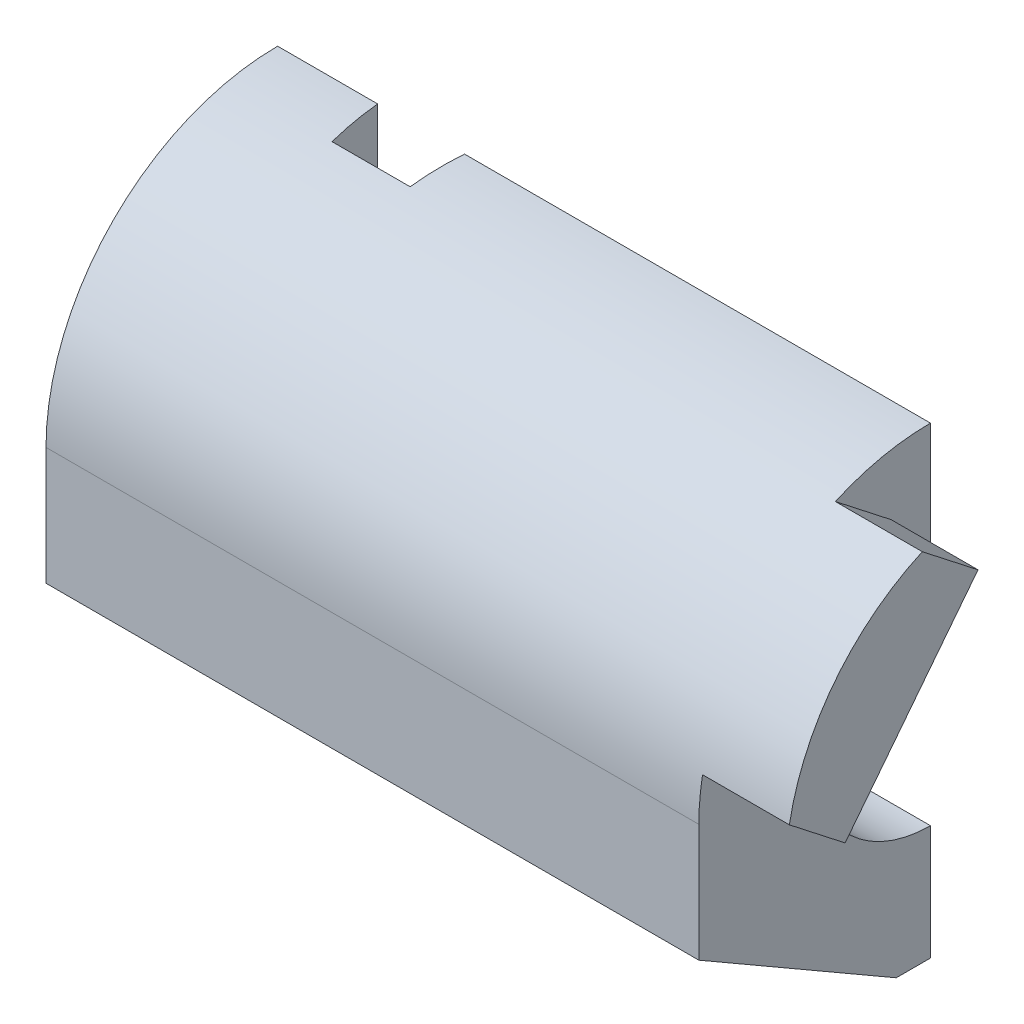
ISO-10303-21;
HEADER;
FILE_DESCRIPTION(('STEP AP214'),'2;1');
FILE_NAME('part.step','',(''),(''),'','','');
FILE_SCHEMA(('AUTOMOTIVE_DESIGN { 1 0 10303 214 1 1 1 1 }'));
ENDSEC;
DATA;
#1=APPLICATION_CONTEXT('core data for automotive mechanical design processes');
#2=APPLICATION_PROTOCOL_DEFINITION('international standard','automotive_design',2000,#1);
#3=PRODUCT_CONTEXT('',#1,'mechanical');
#4=PRODUCT('Part','Part','',(#3));
#5=PRODUCT_RELATED_PRODUCT_CATEGORY('part','',(#4));
#6=PRODUCT_DEFINITION_FORMATION('','',#4);
#7=PRODUCT_DEFINITION_CONTEXT('part definition',#1,'design');
#8=PRODUCT_DEFINITION('design','',#6,#7);
#9=PRODUCT_DEFINITION_SHAPE('','',#8);
#10=(LENGTH_UNIT() NAMED_UNIT(*) SI_UNIT(.MILLI.,.METRE.));
#11=(NAMED_UNIT(*) PLANE_ANGLE_UNIT() SI_UNIT($,.RADIAN.));
#12=(NAMED_UNIT(*) SI_UNIT($,.STERADIAN.) SOLID_ANGLE_UNIT());
#13=UNCERTAINTY_MEASURE_WITH_UNIT(LENGTH_MEASURE(1.E-05),#10,'distance_accuracy_value','');
#14=(GEOMETRIC_REPRESENTATION_CONTEXT(3) GLOBAL_UNCERTAINTY_ASSIGNED_CONTEXT((#13)) GLOBAL_UNIT_ASSIGNED_CONTEXT((#10,
#11,#12)) REPRESENTATION_CONTEXT('',''));
#15=CARTESIAN_POINT('',(0.,0.,0.));
#16=DIRECTION('',(0.,0.,1.));
#17=DIRECTION('',(1.,0.,0.));
#18=AXIS2_PLACEMENT_3D('',#15,#16,#17);
#19=CARTESIAN_POINT('',(124.,88.,0.));
#20=DIRECTION('',(0.,0.,1.));
#21=DIRECTION('',(0.,-1.,0.));
#22=AXIS2_PLACEMENT_3D('',#19,#20,#21);
#23=PLANE('',#22);
#24=DIRECTION('',(0.,-1.,0.));
#25=VECTOR('',#24,1.);
#26=CARTESIAN_POINT('',(-53.,88.,0.));
#27=LINE('',#26,#25);
#28=CARTESIAN_POINT('',(-53.,88.,0.));
#29=VERTEX_POINT('',#28);
#30=CARTESIAN_POINT('',(-53.,28.575,0.));
#31=VERTEX_POINT('',#30);
#32=EDGE_CURVE('E213',#29,#31,#27,.T.);
#33=ORIENTED_EDGE('',*,*,#32,.F.);
#34=DIRECTION('',(-1.,0.,0.));
#35=VECTOR('',#34,1.);
#36=CARTESIAN_POINT('',(124.,88.,0.));
#37=LINE('',#36,#35);
#38=CARTESIAN_POINT('',(124.,88.,0.));
#39=VERTEX_POINT('',#38);
#40=EDGE_CURVE('E303',#39,#29,#37,.T.);
#41=ORIENTED_EDGE('',*,*,#40,.F.);
#42=DIRECTION('',(0.,1.,0.));
#43=VECTOR('',#42,1.);
#44=CARTESIAN_POINT('',(124.,88.,0.));
#45=LINE('',#44,#43);
#46=CARTESIAN_POINT('',(124.,44.45,0.));
#47=VERTEX_POINT('',#46);
#48=EDGE_CURVE('E281',#47,#39,#45,.T.);
#49=ORIENTED_EDGE('',*,*,#48,.F.);
#50=DIRECTION('',(1.,0.,0.));
#51=VECTOR('',#50,1.);
#52=CARTESIAN_POINT('',(46.,44.45,0.));
#53=LINE('',#52,#51);
#54=CARTESIAN_POINT('',(46.,44.45,0.));
#55=VERTEX_POINT('',#54);
#56=EDGE_CURVE('E265',#47,#55,#53,.F.);
#57=ORIENTED_EDGE('',*,*,#56,.T.);
#58=DIRECTION('',(0.,1.,0.));
#59=VECTOR('',#58,1.);
#60=CARTESIAN_POINT('',(46.,88.,0.));
#61=LINE('',#60,#59);
#62=CARTESIAN_POINT('',(46.,28.575,0.));
#63=VERTEX_POINT('',#62);
#64=EDGE_CURVE('E315',#63,#55,#61,.T.);
#65=ORIENTED_EDGE('',*,*,#64,.F.);
#66=DIRECTION('',(-1.,0.,0.));
#67=VECTOR('',#66,1.);
#68=CARTESIAN_POINT('',(126.822305089622,28.575,0.));
#69=LINE('',#68,#67);
#70=EDGE_CURVE('E258',#63,#31,#69,.T.);
#71=ORIENTED_EDGE('',*,*,#70,.T.);
#72=EDGE_LOOP('',(#33,#41,#49,#57,#65,#71));
#73=FACE_BOUND('',#72,.T.);
#74=ADVANCED_FACE('F34',(#73),#23,.F.);
#75=DIRECTION('',(0.,-1.,0.));
#76=VECTOR('',#75,1.);
#77=CARTESIAN_POINT('',(-86.,88.,0.));
#78=LINE('',#77,#76);
#79=CARTESIAN_POINT('',(-86.,88.,0.));
#80=VERTEX_POINT('',#79);
#81=CARTESIAN_POINT('',(-86.,28.575,0.));
#82=VERTEX_POINT('',#81);
#83=EDGE_CURVE('E210',#80,#82,#78,.T.);
#84=ORIENTED_EDGE('',*,*,#83,.T.);
#85=CARTESIAN_POINT('',(-124.,28.575,0.));
#86=VERTEX_POINT('',#85);
#87=EDGE_CURVE('E257',#82,#86,#69,.T.);
#88=ORIENTED_EDGE('',*,*,#87,.T.);
#89=DIRECTION('',(0.,1.,0.));
#90=VECTOR('',#89,1.);
#91=CARTESIAN_POINT('',(-124.,88.,0.));
#92=LINE('',#91,#90);
#93=CARTESIAN_POINT('',(-124.,88.,0.));
#94=VERTEX_POINT('',#93);
#95=EDGE_CURVE('E294',#86,#94,#92,.T.);
#96=ORIENTED_EDGE('',*,*,#95,.T.);
#97=EDGE_CURVE('E302',#80,#94,#37,.T.);
#98=ORIENTED_EDGE('',*,*,#97,.F.);
#99=EDGE_LOOP('',(#84,#88,#96,#98));
#100=FACE_BOUND('',#99,.T.);
#101=ADVANCED_FACE('F330',(#100),#23,.F.);
#102=CARTESIAN_POINT('',(124.,0.,0.));
#103=DIRECTION('',(-1.,0.,0.));
#104=DIRECTION('',(0.,0.,1.));
#105=AXIS2_PLACEMENT_3D('',#102,#103,#104);
#106=CYLINDRICAL_SURFACE('',#105,88.);
#107=CARTESIAN_POINT('',(-53.,0.,0.));
#108=DIRECTION('',(-0.996194698091746,0.,-0.0871557427476584));
#109=DIRECTION('',(-0.0871557427476584,0.,0.996194698091746));
#110=AXIS2_PLACEMENT_3D('',#107,#108,#109);
#111=ELLIPSE('',#110,88.3361457038146,88.);
#112=CARTESIAN_POINT('',(-54.6622846069926,85.9243853629457,19.));
#113=VERTEX_POINT('',#112);
#114=EDGE_CURVE('E219',#113,#29,#111,.T.);
#115=ORIENTED_EDGE('',*,*,#114,.F.);
#116=DIRECTION('',(-1.,0.,0.));
#117=VECTOR('',#116,1.);
#118=CARTESIAN_POINT('',(124.,85.9243853629457,19.));
#119=LINE('',#118,#117);
#120=CARTESIAN_POINT('',(-84.3377153930074,85.9243853629457,19.));
#121=VERTEX_POINT('',#120);
#122=EDGE_CURVE('E215',#121,#113,#119,.F.);
#123=ORIENTED_EDGE('',*,*,#122,.F.);
#124=CARTESIAN_POINT('',(-86.,0.,0.));
#125=DIRECTION('',(0.996194698091746,0.,-0.087155742747658));
#126=DIRECTION('',(-0.087155742747658,0.,-0.996194698091746));
#127=AXIS2_PLACEMENT_3D('',#124,#125,#126);
#128=ELLIPSE('',#127,88.3361457038146,88.);
#129=EDGE_CURVE('E217',#80,#121,#128,.T.);
#130=ORIENTED_EDGE('',*,*,#129,.F.);
#131=ORIENTED_EDGE('',*,*,#97,.T.);
#132=CARTESIAN_POINT('',(-124.,0.,0.));
#133=DIRECTION('',(1.,0.,0.));
#134=DIRECTION('',(0.,0.,-1.));
#135=AXIS2_PLACEMENT_3D('',#132,#133,#134);
#136=CIRCLE('',#135,88.);
#137=CARTESIAN_POINT('',(-124.,0.,88.));
#138=VERTEX_POINT('',#137);
#139=EDGE_CURVE('E277',#94,#138,#136,.T.);
#140=ORIENTED_EDGE('',*,*,#139,.T.);
#141=DIRECTION('',(-1.,0.,0.));
#142=VECTOR('',#141,1.);
#143=CARTESIAN_POINT('',(124.,0.,88.));
#144=LINE('',#143,#142);
#145=CARTESIAN_POINT('',(124.,0.,88.));
#146=VERTEX_POINT('',#145);
#147=EDGE_CURVE('E287',#146,#138,#144,.T.);
#148=ORIENTED_EDGE('',*,*,#147,.F.);
#149=CARTESIAN_POINT('',(124.,0.,0.));
#150=DIRECTION('',(1.,0.,0.));
#151=DIRECTION('',(0.,0.,-1.));
#152=AXIS2_PLACEMENT_3D('',#149,#150,#151);
#153=CIRCLE('',#152,88.);
#154=CARTESIAN_POINT('',(124.,15.6302050309526,86.6007892036232));
#155=VERTEX_POINT('',#154);
#156=EDGE_CURVE('E199',#155,#146,#153,.T.);
#157=ORIENTED_EDGE('',*,*,#156,.F.);
#158=DIRECTION('',(-1.,0.,0.));
#159=VECTOR('',#158,1.);
#160=CARTESIAN_POINT('',(157.,15.6302050309526,86.6007892036232));
#161=LINE('',#160,#159);
#162=CARTESIAN_POINT('',(157.,15.6302050309526,86.6007892036232));
#163=VERTEX_POINT('',#162);
#164=EDGE_CURVE('E180',#163,#155,#161,.T.);
#165=ORIENTED_EDGE('',*,*,#164,.F.);
#166=CARTESIAN_POINT('',(157.,0.,0.));
#167=DIRECTION('',(1.,0.,0.));
#168=DIRECTION('',(0.,0.,-1.));
#169=AXIS2_PLACEMENT_3D('',#166,#167,#168);
#170=CIRCLE('',#169,88.);
#171=CARTESIAN_POINT('',(157.,80.2470868267041,36.1165482269196));
#172=VERTEX_POINT('',#171);
#173=EDGE_CURVE('E186',#172,#163,#170,.T.);
#174=ORIENTED_EDGE('',*,*,#173,.F.);
#175=DIRECTION('',(-1.,0.,0.));
#176=VECTOR('',#175,1.);
#177=CARTESIAN_POINT('',(157.,80.2470868267041,36.1165482269196));
#178=LINE('',#177,#176);
#179=CARTESIAN_POINT('',(124.,80.2470868267041,36.1165482269196));
#180=VERTEX_POINT('',#179);
#181=EDGE_CURVE('E391',#172,#180,#178,.T.);
#182=ORIENTED_EDGE('',*,*,#181,.T.);
#183=EDGE_CURVE('E285',#39,#180,#153,.T.);
#184=ORIENTED_EDGE('',*,*,#183,.F.);
#185=ORIENTED_EDGE('',*,*,#40,.T.);
#186=EDGE_LOOP('',(#115,#123,#130,#131,#140,#148,#157,#165,#174,#182,#184,#185));
#187=FACE_BOUND('',#186,.T.);
#188=ADVANCED_FACE('F197',(#187),#106,.T.);
#189=CARTESIAN_POINT('',(126.822305089622,0.,0.));
#190=DIRECTION('',(-1.,0.,0.));
#191=DIRECTION('',(0.,0.,1.));
#192=AXIS2_PLACEMENT_3D('',#189,#190,#191);
#193=CYLINDRICAL_SURFACE('',#192,28.575);
#194=CARTESIAN_POINT('',(-53.,0.,0.));
#195=DIRECTION('',(-0.996194698091746,0.,-0.0871557427476584));
#196=DIRECTION('',(-0.0871557427476584,0.,0.996194698091746));
#197=AXIS2_PLACEMENT_3D('',#194,#195,#196);
#198=ELLIPSE('',#197,28.6841518578012,28.575);
#199=CARTESIAN_POINT('',(-54.6622846069925,21.343163425322,19.));
#200=VERTEX_POINT('',#199);
#201=EDGE_CURVE('E11',#31,#200,#198,.F.);
#202=ORIENTED_EDGE('',*,*,#201,.F.);
#203=ORIENTED_EDGE('',*,*,#70,.F.);
#204=CARTESIAN_POINT('',(46.,0.,0.));
#205=DIRECTION('',(1.,0.,0.));
#206=DIRECTION('',(0.,0.,-1.));
#207=AXIS2_PLACEMENT_3D('',#204,#205,#206);
#208=CIRCLE('',#207,28.575);
#209=CARTESIAN_POINT('',(46.,-28.575,0.));
#210=VERTEX_POINT('',#209);
#211=EDGE_CURVE('E251',#210,#63,#208,.F.);
#212=ORIENTED_EDGE('',*,*,#211,.F.);
#213=DIRECTION('',(-1.,0.,0.));
#214=VECTOR('',#213,1.);
#215=CARTESIAN_POINT('',(126.822305089622,-28.575,0.));
#216=LINE('',#215,#214);
#217=CARTESIAN_POINT('',(-124.,-28.575,0.));
#218=VERTEX_POINT('',#217);
#219=EDGE_CURVE('E254',#218,#210,#216,.F.);
#220=ORIENTED_EDGE('',*,*,#219,.F.);
#221=CARTESIAN_POINT('',(-124.,0.,0.));
#222=DIRECTION('',(-1.,0.,0.));
#223=DIRECTION('',(0.,0.,1.));
#224=AXIS2_PLACEMENT_3D('',#221,#222,#223);
#225=CIRCLE('',#224,28.575);
#226=EDGE_CURVE('E242',#218,#86,#225,.T.);
#227=ORIENTED_EDGE('',*,*,#226,.T.);
#228=ORIENTED_EDGE('',*,*,#87,.F.);
#229=CARTESIAN_POINT('',(-86.,0.,0.));
#230=DIRECTION('',(0.996194698091746,0.,-0.087155742747658));
#231=DIRECTION('',(-0.087155742747658,0.,-0.996194698091746));
#232=AXIS2_PLACEMENT_3D('',#229,#230,#231);
#233=ELLIPSE('',#232,28.6841518578012,28.575);
#234=CARTESIAN_POINT('',(-84.3377153930074,21.343163425322,19.));
#235=VERTEX_POINT('',#234);
#236=EDGE_CURVE('E42',#235,#82,#233,.F.);
#237=ORIENTED_EDGE('',*,*,#236,.F.);
#238=DIRECTION('',(-1.,0.,0.));
#239=VECTOR('',#238,1.);
#240=CARTESIAN_POINT('',(126.822305089622,21.343163425322,19.));
#241=LINE('',#240,#239);
#242=EDGE_CURVE('E319',#200,#235,#241,.T.);
#243=ORIENTED_EDGE('',*,*,#242,.F.);
#244=EDGE_LOOP('',(#202,#203,#212,#220,#227,#228,#237,#243));
#245=FACE_BOUND('',#244,.T.);
#246=ADVANCED_FACE('F333',(#245),#193,.F.);
#247=CARTESIAN_POINT('',(124.,-44.6987298107779,88.));
#248=DIRECTION('',(0.,0.,-1.));
#249=DIRECTION('',(0.,1.,0.));
#250=AXIS2_PLACEMENT_3D('',#247,#248,#249);
#251=PLANE('',#250);
#252=DIRECTION('',(0.,-1.,0.));
#253=VECTOR('',#252,1.);
#254=CARTESIAN_POINT('',(-124.,-44.6987298107779,88.));
#255=LINE('',#254,#253);
#256=CARTESIAN_POINT('',(-124.,-44.6987298107779,88.));
#257=VERTEX_POINT('',#256);
#258=EDGE_CURVE('E272',#138,#257,#255,.T.);
#259=ORIENTED_EDGE('',*,*,#258,.T.);
#260=DIRECTION('',(-1.,0.,0.));
#261=VECTOR('',#260,1.);
#262=CARTESIAN_POINT('',(124.,-44.6987298107779,88.));
#263=LINE('',#262,#261);
#264=CARTESIAN_POINT('',(124.,-44.6987298107779,88.));
#265=VERTEX_POINT('',#264);
#266=EDGE_CURVE('E312',#265,#257,#263,.T.);
#267=ORIENTED_EDGE('',*,*,#266,.F.);
#268=DIRECTION('',(0.,-1.,0.));
#269=VECTOR('',#268,1.);
#270=CARTESIAN_POINT('',(124.,-44.6987298107779,88.));
#271=LINE('',#270,#269);
#272=EDGE_CURVE('E273',#146,#265,#271,.T.);
#273=ORIENTED_EDGE('',*,*,#272,.F.);
#274=ORIENTED_EDGE('',*,*,#147,.T.);
#275=EDGE_LOOP('',(#259,#267,#273,#274));
#276=FACE_BOUND('',#275,.T.);
#277=ADVANCED_FACE('F36',(#276),#251,.F.);
#278=CARTESIAN_POINT('',(124.,-88.,13.));
#279=DIRECTION('',(0.,0.866025403784438,-0.500000000000001));
#280=DIRECTION('',(0.,0.500000000000001,0.866025403784438));
#281=AXIS2_PLACEMENT_3D('',#278,#279,#280);
#282=PLANE('',#281);
#283=DIRECTION('',(0.,-0.500000000000001,-0.866025403784438));
#284=VECTOR('',#283,1.);
#285=CARTESIAN_POINT('',(-124.,-88.,13.));
#286=LINE('',#285,#284);
#287=CARTESIAN_POINT('',(-124.,-88.,13.));
#288=VERTEX_POINT('',#287);
#289=EDGE_CURVE('E290',#257,#288,#286,.T.);
#290=ORIENTED_EDGE('',*,*,#289,.T.);
#291=DIRECTION('',(-1.,0.,0.));
#292=VECTOR('',#291,1.);
#293=CARTESIAN_POINT('',(124.,-88.,13.));
#294=LINE('',#293,#292);
#295=CARTESIAN_POINT('',(124.,-88.,13.));
#296=VERTEX_POINT('',#295);
#297=EDGE_CURVE('E309',#296,#288,#294,.T.);
#298=ORIENTED_EDGE('',*,*,#297,.F.);
#299=DIRECTION('',(0.,-0.500000000000001,-0.866025403784438));
#300=VECTOR('',#299,1.);
#301=CARTESIAN_POINT('',(124.,-88.,13.));
#302=LINE('',#301,#300);
#303=EDGE_CURVE('E276',#265,#296,#302,.T.);
#304=ORIENTED_EDGE('',*,*,#303,.F.);
#305=ORIENTED_EDGE('',*,*,#266,.T.);
#306=EDGE_LOOP('',(#290,#298,#304,#305));
#307=FACE_BOUND('',#306,.T.);
#308=ADVANCED_FACE('F370',(#307),#282,.F.);
#309=CARTESIAN_POINT('',(124.,-88.,0.));
#310=DIRECTION('',(0.,1.,0.));
#311=DIRECTION('',(0.,0.,1.));
#312=AXIS2_PLACEMENT_3D('',#309,#310,#311);
#313=PLANE('',#312);
#314=DIRECTION('',(0.,0.,-1.));
#315=VECTOR('',#314,1.);
#316=CARTESIAN_POINT('',(-124.,-88.,0.));
#317=LINE('',#316,#315);
#318=CARTESIAN_POINT('',(-124.,-88.,0.));
#319=VERTEX_POINT('',#318);
#320=EDGE_CURVE('E292',#288,#319,#317,.T.);
#321=ORIENTED_EDGE('',*,*,#320,.T.);
#322=DIRECTION('',(-1.,0.,0.));
#323=VECTOR('',#322,1.);
#324=CARTESIAN_POINT('',(124.,-88.,0.));
#325=LINE('',#324,#323);
#326=CARTESIAN_POINT('',(124.,-88.,0.));
#327=VERTEX_POINT('',#326);
#328=EDGE_CURVE('E306',#327,#319,#325,.T.);
#329=ORIENTED_EDGE('',*,*,#328,.F.);
#330=DIRECTION('',(0.,0.,-1.));
#331=VECTOR('',#330,1.);
#332=CARTESIAN_POINT('',(124.,-88.,0.));
#333=LINE('',#332,#331);
#334=EDGE_CURVE('E279',#296,#327,#333,.T.);
#335=ORIENTED_EDGE('',*,*,#334,.F.);
#336=ORIENTED_EDGE('',*,*,#297,.T.);
#337=EDGE_LOOP('',(#321,#329,#335,#336));
#338=FACE_BOUND('',#337,.T.);
#339=ADVANCED_FACE('F366',(#338),#313,.F.);
#340=CARTESIAN_POINT('',(-11.,-62.,0.));
#341=DIRECTION('',(0.,0.,-1.));
#342=DIRECTION('',(0.,1.,0.));
#343=AXIS2_PLACEMENT_3D('',#340,#341,#342);
#344=CIRCLE('',#343,11.);
#345=CARTESIAN_POINT('',(-11.,-51.,0.));
#346=VERTEX_POINT('',#345);
#347=CARTESIAN_POINT('',(-11.,-73.,0.));
#348=VERTEX_POINT('',#347);
#349=EDGE_CURVE('E221',#346,#348,#344,.T.);
#350=ORIENTED_EDGE('',*,*,#349,.F.);
#351=DIRECTION('',(1.,0.,0.));
#352=VECTOR('',#351,1.);
#353=CARTESIAN_POINT('',(-124.,-51.,0.));
#354=LINE('',#353,#352);
#355=CARTESIAN_POINT('',(-124.,-51.,0.));
#356=VERTEX_POINT('',#355);
#357=EDGE_CURVE('E226',#356,#346,#354,.T.);
#358=ORIENTED_EDGE('',*,*,#357,.F.);
#359=EDGE_CURVE('E298',#356,#218,#92,.T.);
#360=ORIENTED_EDGE('',*,*,#359,.T.);
#361=ORIENTED_EDGE('',*,*,#219,.T.);
#362=CARTESIAN_POINT('',(46.,-44.45,0.));
#363=VERTEX_POINT('',#362);
#364=EDGE_CURVE('E316',#363,#210,#61,.T.);
#365=ORIENTED_EDGE('',*,*,#364,.F.);
#366=DIRECTION('',(1.,0.,0.));
#367=VECTOR('',#366,1.);
#368=CARTESIAN_POINT('',(46.,-44.45,0.));
#369=LINE('',#368,#367);
#370=CARTESIAN_POINT('',(124.,-44.45,0.));
#371=VERTEX_POINT('',#370);
#372=EDGE_CURVE('E269',#363,#371,#369,.T.);
#373=ORIENTED_EDGE('',*,*,#372,.T.);
#374=EDGE_CURVE('E282',#327,#371,#45,.T.);
#375=ORIENTED_EDGE('',*,*,#374,.F.);
#376=ORIENTED_EDGE('',*,*,#328,.T.);
#377=CARTESIAN_POINT('',(-124.,-73.,0.));
#378=VERTEX_POINT('',#377);
#379=EDGE_CURVE('E295',#319,#378,#92,.T.);
#380=ORIENTED_EDGE('',*,*,#379,.T.);
#381=DIRECTION('',(-1.,0.,0.));
#382=VECTOR('',#381,1.);
#383=CARTESIAN_POINT('',(-124.,-73.,0.));
#384=LINE('',#383,#382);
#385=EDGE_CURVE('E236',#348,#378,#384,.T.);
#386=ORIENTED_EDGE('',*,*,#385,.F.);
#387=EDGE_LOOP('',(#350,#358,#360,#361,#365,#373,#375,#376,#380,#386));
#388=FACE_BOUND('',#387,.T.);
#389=ADVANCED_FACE('F345',(#388),#23,.F.);
#390=CARTESIAN_POINT('',(124.,0.,0.));
#391=DIRECTION('',(1.,0.,0.));
#392=DIRECTION('',(0.,0.,-1.));
#393=AXIS2_PLACEMENT_3D('',#390,#391,#392);
#394=PLANE('',#393);
#395=DIRECTION('',(0.,0.615661475325654,0.788010753606725));
#396=VECTOR('',#395,1.);
#397=CARTESIAN_POINT('',(124.,80.2470868267041,36.1165482269196));
#398=LINE('',#397,#396);
#399=CARTESIAN_POINT('',(124.,63.7071761394841,14.9464279455913));
#400=VERTEX_POINT('',#399);
#401=EDGE_CURVE('E49',#400,#180,#398,.T.);
#402=ORIENTED_EDGE('',*,*,#401,.F.);
#403=DIRECTION('',(0.,0.788010753606726,-0.615661475325653));
#404=VECTOR('',#403,1.);
#405=CARTESIAN_POINT('',(124.,63.7071761394841,14.9464279455913));
#406=LINE('',#405,#404);
#407=CARTESIAN_POINT('',(124.,-0.909705656267409,65.4306689222948));
#408=VERTEX_POINT('',#407);
#409=EDGE_CURVE('E396',#408,#400,#406,.T.);
#410=ORIENTED_EDGE('',*,*,#409,.F.);
#411=DIRECTION('',(0.,-0.615661475325653,-0.788010753606726));
#412=VECTOR('',#411,1.);
#413=CARTESIAN_POINT('',(124.,-0.909705656267409,65.4306689222948));
#414=LINE('',#413,#412);
#415=EDGE_CURVE('E55',#155,#408,#414,.T.);
#416=ORIENTED_EDGE('',*,*,#415,.F.);
#417=ORIENTED_EDGE('',*,*,#156,.T.);
#418=ORIENTED_EDGE('',*,*,#272,.T.);
#419=ORIENTED_EDGE('',*,*,#303,.T.);
#420=ORIENTED_EDGE('',*,*,#334,.T.);
#421=ORIENTED_EDGE('',*,*,#374,.T.);
#422=CARTESIAN_POINT('',(124.,0.,0.));
#423=DIRECTION('',(1.,0.,0.));
#424=DIRECTION('',(0.,0.,-1.));
#425=AXIS2_PLACEMENT_3D('',#422,#423,#424);
#426=CIRCLE('',#425,44.45);
#427=EDGE_CURVE('E261',#47,#371,#426,.T.);
#428=ORIENTED_EDGE('',*,*,#427,.F.);
#429=ORIENTED_EDGE('',*,*,#48,.T.);
#430=ORIENTED_EDGE('',*,*,#183,.T.);
#431=EDGE_LOOP('',(#402,#410,#416,#417,#418,#419,#420,#421,#428,#429,#430));
#432=FACE_BOUND('',#431,.T.);
#433=ADVANCED_FACE('F389',(#432),#394,.T.);
#434=CARTESIAN_POINT('',(-124.,0.,0.));
#435=DIRECTION('',(1.,0.,0.));
#436=DIRECTION('',(0.,0.,-1.));
#437=AXIS2_PLACEMENT_3D('',#434,#435,#436);
#438=PLANE('',#437);
#439=ORIENTED_EDGE('',*,*,#359,.F.);
#440=DIRECTION('',(0.,0.,-1.));
#441=VECTOR('',#440,1.);
#442=CARTESIAN_POINT('',(-124.,-51.,13.));
#443=LINE('',#442,#441);
#444=CARTESIAN_POINT('',(-124.,-51.,13.));
#445=VERTEX_POINT('',#444);
#446=EDGE_CURVE('E243',#445,#356,#443,.T.);
#447=ORIENTED_EDGE('',*,*,#446,.F.);
#448=DIRECTION('',(0.,1.,0.));
#449=VECTOR('',#448,1.);
#450=CARTESIAN_POINT('',(-124.,-51.,13.));
#451=LINE('',#450,#449);
#452=CARTESIAN_POINT('',(-124.,-73.,13.));
#453=VERTEX_POINT('',#452);
#454=EDGE_CURVE('E228',#453,#445,#451,.T.);
#455=ORIENTED_EDGE('',*,*,#454,.F.);
#456=DIRECTION('',(0.,0.,-1.));
#457=VECTOR('',#456,1.);
#458=CARTESIAN_POINT('',(-124.,-73.,13.));
#459=LINE('',#458,#457);
#460=EDGE_CURVE('E245',#453,#378,#459,.T.);
#461=ORIENTED_EDGE('',*,*,#460,.T.);
#462=ORIENTED_EDGE('',*,*,#379,.F.);
#463=ORIENTED_EDGE('',*,*,#320,.F.);
#464=ORIENTED_EDGE('',*,*,#289,.F.);
#465=ORIENTED_EDGE('',*,*,#258,.F.);
#466=ORIENTED_EDGE('',*,*,#139,.F.);
#467=ORIENTED_EDGE('',*,*,#95,.F.);
#468=ORIENTED_EDGE('',*,*,#226,.F.);
#469=EDGE_LOOP('',(#439,#447,#455,#461,#462,#463,#464,#465,#466,#467,#468));
#470=FACE_BOUND('',#469,.T.);
#471=ADVANCED_FACE('F340',(#470),#438,.F.);
#472=CARTESIAN_POINT('',(46.,0.,0.));
#473=DIRECTION('',(1.,0.,0.));
#474=DIRECTION('',(0.,0.,-1.));
#475=AXIS2_PLACEMENT_3D('',#472,#473,#474);
#476=PLANE('',#475);
#477=ORIENTED_EDGE('',*,*,#211,.T.);
#478=ORIENTED_EDGE('',*,*,#64,.T.);
#479=CARTESIAN_POINT('',(46.,0.,0.));
#480=DIRECTION('',(1.,0.,0.));
#481=DIRECTION('',(0.,0.,-1.));
#482=AXIS2_PLACEMENT_3D('',#479,#480,#481);
#483=CIRCLE('',#482,44.45);
#484=EDGE_CURVE('E262',#55,#363,#483,.T.);
#485=ORIENTED_EDGE('',*,*,#484,.T.);
#486=ORIENTED_EDGE('',*,*,#364,.T.);
#487=EDGE_LOOP('',(#477,#478,#485,#486));
#488=FACE_BOUND('',#487,.T.);
#489=ADVANCED_FACE('F385',(#488),#476,.T.);
#490=CARTESIAN_POINT('',(46.,0.,0.));
#491=DIRECTION('',(1.,0.,0.));
#492=DIRECTION('',(0.,0.,-1.));
#493=AXIS2_PLACEMENT_3D('',#490,#491,#492);
#494=CYLINDRICAL_SURFACE('',#493,44.45);
#495=ORIENTED_EDGE('',*,*,#484,.F.);
#496=ORIENTED_EDGE('',*,*,#56,.F.);
#497=ORIENTED_EDGE('',*,*,#427,.T.);
#498=ORIENTED_EDGE('',*,*,#372,.F.);
#499=EDGE_LOOP('',(#495,#496,#497,#498));
#500=FACE_BOUND('',#499,.T.);
#501=ADVANCED_FACE('F387',(#500),#494,.F.);
#502=CARTESIAN_POINT('',(-11.,-62.,13.));
#503=DIRECTION('',(0.,0.,-1.));
#504=DIRECTION('',(0.,1.,0.));
#505=AXIS2_PLACEMENT_3D('',#502,#503,#504);
#506=CYLINDRICAL_SURFACE('',#505,11.);
#507=ORIENTED_EDGE('',*,*,#349,.T.);
#508=DIRECTION('',(0.,0.,-1.));
#509=VECTOR('',#508,1.);
#510=CARTESIAN_POINT('',(-11.,-73.,13.));
#511=LINE('',#510,#509);
#512=CARTESIAN_POINT('',(-11.,-73.,13.));
#513=VERTEX_POINT('',#512);
#514=EDGE_CURVE('E233',#513,#348,#511,.T.);
#515=ORIENTED_EDGE('',*,*,#514,.F.);
#516=CARTESIAN_POINT('',(-11.,-62.,13.));
#517=DIRECTION('',(0.,0.,-1.));
#518=DIRECTION('',(0.,1.,0.));
#519=AXIS2_PLACEMENT_3D('',#516,#517,#518);
#520=CIRCLE('',#519,11.);
#521=CARTESIAN_POINT('',(-11.,-51.,13.));
#522=VERTEX_POINT('',#521);
#523=EDGE_CURVE('E222',#522,#513,#520,.T.);
#524=ORIENTED_EDGE('',*,*,#523,.F.);
#525=DIRECTION('',(0.,0.,-1.));
#526=VECTOR('',#525,1.);
#527=CARTESIAN_POINT('',(-11.,-51.,13.));
#528=LINE('',#527,#526);
#529=EDGE_CURVE('E240',#522,#346,#528,.T.);
#530=ORIENTED_EDGE('',*,*,#529,.T.);
#531=EDGE_LOOP('',(#507,#515,#524,#530));
#532=FACE_BOUND('',#531,.T.);
#533=ADVANCED_FACE('F441',(#532),#506,.F.);
#534=CARTESIAN_POINT('',(-124.,-51.,13.));
#535=DIRECTION('',(0.,1.,0.));
#536=DIRECTION('',(0.,0.,1.));
#537=AXIS2_PLACEMENT_3D('',#534,#535,#536);
#538=PLANE('',#537);
#539=ORIENTED_EDGE('',*,*,#357,.T.);
#540=ORIENTED_EDGE('',*,*,#529,.F.);
#541=DIRECTION('',(1.,0.,0.));
#542=VECTOR('',#541,1.);
#543=CARTESIAN_POINT('',(-124.,-51.,13.));
#544=LINE('',#543,#542);
#545=EDGE_CURVE('E230',#445,#522,#544,.T.);
#546=ORIENTED_EDGE('',*,*,#545,.F.);
#547=ORIENTED_EDGE('',*,*,#446,.T.);
#548=EDGE_LOOP('',(#539,#540,#546,#547));
#549=FACE_BOUND('',#548,.T.);
#550=ADVANCED_FACE('F351',(#549),#538,.F.);
#551=CARTESIAN_POINT('',(-124.,-73.,13.));
#552=DIRECTION('',(0.,-1.,0.));
#553=DIRECTION('',(1.,0.,0.));
#554=AXIS2_PLACEMENT_3D('',#551,#552,#553);
#555=PLANE('',#554);
#556=ORIENTED_EDGE('',*,*,#385,.T.);
#557=ORIENTED_EDGE('',*,*,#460,.F.);
#558=DIRECTION('',(-1.,0.,0.));
#559=VECTOR('',#558,1.);
#560=CARTESIAN_POINT('',(-124.,-73.,13.));
#561=LINE('',#560,#559);
#562=EDGE_CURVE('E225',#513,#453,#561,.T.);
#563=ORIENTED_EDGE('',*,*,#562,.F.);
#564=ORIENTED_EDGE('',*,*,#514,.T.);
#565=EDGE_LOOP('',(#556,#557,#563,#564));
#566=FACE_BOUND('',#565,.T.);
#567=ADVANCED_FACE('F358',(#566),#555,.F.);
#568=CARTESIAN_POINT('',(-11.,-62.,13.));
#569=DIRECTION('',(0.,0.,-1.));
#570=DIRECTION('',(0.,1.,0.));
#571=AXIS2_PLACEMENT_3D('',#568,#569,#570);
#572=PLANE('',#571);
#573=ORIENTED_EDGE('',*,*,#523,.T.);
#574=ORIENTED_EDGE('',*,*,#562,.T.);
#575=ORIENTED_EDGE('',*,*,#454,.T.);
#576=ORIENTED_EDGE('',*,*,#545,.T.);
#577=EDGE_LOOP('',(#573,#574,#575,#576));
#578=FACE_BOUND('',#577,.T.);
#579=ADVANCED_FACE('F354',(#578),#572,.T.);
#580=CARTESIAN_POINT('',(-53.,88.,0.));
#581=DIRECTION('',(-0.996194698091746,0.,-0.0871557427476584));
#582=DIRECTION('',(-0.0871557427476584,0.,0.996194698091746));
#583=AXIS2_PLACEMENT_3D('',#580,#581,#582);
#584=PLANE('',#583);
#585=ORIENTED_EDGE('',*,*,#114,.T.);
#586=ORIENTED_EDGE('',*,*,#32,.T.);
#587=ORIENTED_EDGE('',*,*,#201,.T.);
#588=DIRECTION('',(0.,-1.,0.));
#589=VECTOR('',#588,1.);
#590=CARTESIAN_POINT('',(-54.6622846069926,88.,19.));
#591=LINE('',#590,#589);
#592=EDGE_CURVE('E200',#113,#200,#591,.T.);
#593=ORIENTED_EDGE('',*,*,#592,.F.);
#594=EDGE_LOOP('',(#585,#586,#587,#593));
#595=FACE_BOUND('',#594,.T.);
#596=ADVANCED_FACE('F483',(#595),#584,.T.);
#597=CARTESIAN_POINT('',(-86.,88.,0.));
#598=DIRECTION('',(0.996194698091746,0.,-0.087155742747658));
#599=DIRECTION('',(-0.087155742747658,0.,-0.996194698091746));
#600=AXIS2_PLACEMENT_3D('',#597,#598,#599);
#601=PLANE('',#600);
#602=ORIENTED_EDGE('',*,*,#129,.T.);
#603=DIRECTION('',(0.,-1.,0.));
#604=VECTOR('',#603,1.);
#605=CARTESIAN_POINT('',(-84.3377153930074,88.,19.));
#606=LINE('',#605,#604);
#607=EDGE_CURVE('E202',#121,#235,#606,.T.);
#608=ORIENTED_EDGE('',*,*,#607,.T.);
#609=ORIENTED_EDGE('',*,*,#236,.T.);
#610=ORIENTED_EDGE('',*,*,#83,.F.);
#611=EDGE_LOOP('',(#602,#608,#609,#610));
#612=FACE_BOUND('',#611,.T.);
#613=ADVANCED_FACE('F322',(#612),#601,.T.);
#614=CARTESIAN_POINT('',(-54.6622846069926,88.,19.));
#615=DIRECTION('',(0.,0.,-1.));
#616=DIRECTION('',(-1.,0.,0.));
#617=AXIS2_PLACEMENT_3D('',#614,#615,#616);
#618=PLANE('',#617);
#619=ORIENTED_EDGE('',*,*,#122,.T.);
#620=ORIENTED_EDGE('',*,*,#592,.T.);
#621=ORIENTED_EDGE('',*,*,#242,.T.);
#622=ORIENTED_EDGE('',*,*,#607,.F.);
#623=EDGE_LOOP('',(#619,#620,#621,#622));
#624=FACE_BOUND('',#623,.T.);
#625=ADVANCED_FACE('F375',(#624),#618,.T.);
#626=CARTESIAN_POINT('',(157.,-0.909705656267409,65.4306689222948));
#627=DIRECTION('',(0.,0.788010753606726,-0.615661475325653));
#628=DIRECTION('',(0.,0.615661475325653,0.788010753606726));
#629=AXIS2_PLACEMENT_3D('',#626,#627,#628);
#630=PLANE('',#629);
#631=ORIENTED_EDGE('',*,*,#415,.T.);
#632=DIRECTION('',(-1.,0.,0.));
#633=VECTOR('',#632,1.);
#634=CARTESIAN_POINT('',(157.,-0.909705656267409,65.4306689222948));
#635=LINE('',#634,#633);
#636=CARTESIAN_POINT('',(157.,-0.909705656267409,65.4306689222948));
#637=VERTEX_POINT('',#636);
#638=EDGE_CURVE('E182',#637,#408,#635,.T.);
#639=ORIENTED_EDGE('',*,*,#638,.F.);
#640=DIRECTION('',(0.,-0.615661475325653,-0.788010753606726));
#641=VECTOR('',#640,1.);
#642=CARTESIAN_POINT('',(157.,-0.909705656267409,65.4306689222948));
#643=LINE('',#642,#641);
#644=EDGE_CURVE('E176',#163,#637,#643,.T.);
#645=ORIENTED_EDGE('',*,*,#644,.F.);
#646=ORIENTED_EDGE('',*,*,#164,.T.);
#647=EDGE_LOOP('',(#631,#639,#645,#646));
#648=FACE_BOUND('',#647,.T.);
#649=ADVANCED_FACE('F178',(#648),#630,.F.);
#650=CARTESIAN_POINT('',(157.,63.7071761394841,14.9464279455913));
#651=DIRECTION('',(0.,0.615661475325653,0.788010753606726));
#652=DIRECTION('',(0.,-0.788010753606726,0.615661475325653));
#653=AXIS2_PLACEMENT_3D('',#650,#651,#652);
#654=PLANE('',#653);
#655=ORIENTED_EDGE('',*,*,#409,.T.);
#656=DIRECTION('',(-1.,0.,0.));
#657=VECTOR('',#656,1.);
#658=CARTESIAN_POINT('',(157.,63.7071761394841,14.9464279455913));
#659=LINE('',#658,#657);
#660=CARTESIAN_POINT('',(157.,63.7071761394841,14.9464279455913));
#661=VERTEX_POINT('',#660);
#662=EDGE_CURVE('E204',#661,#400,#659,.T.);
#663=ORIENTED_EDGE('',*,*,#662,.F.);
#664=DIRECTION('',(0.,0.788010753606726,-0.615661475325653));
#665=VECTOR('',#664,1.);
#666=CARTESIAN_POINT('',(157.,63.7071761394841,14.9464279455913));
#667=LINE('',#666,#665);
#668=EDGE_CURVE('E185',#637,#661,#667,.T.);
#669=ORIENTED_EDGE('',*,*,#668,.F.);
#670=ORIENTED_EDGE('',*,*,#638,.T.);
#671=EDGE_LOOP('',(#655,#663,#669,#670));
#672=FACE_BOUND('',#671,.T.);
#673=ADVANCED_FACE('F404',(#672),#654,.F.);
#674=CARTESIAN_POINT('',(157.,80.2470868267041,36.1165482269196));
#675=DIRECTION('',(0.,-0.788010753606725,0.615661475325654));
#676=DIRECTION('',(0.,-0.615661475325654,-0.788010753606725));
#677=AXIS2_PLACEMENT_3D('',#674,#675,#676);
#678=PLANE('',#677);
#679=ORIENTED_EDGE('',*,*,#401,.T.);
#680=ORIENTED_EDGE('',*,*,#181,.F.);
#681=DIRECTION('',(0.,0.615661475325654,0.788010753606725));
#682=VECTOR('',#681,1.);
#683=CARTESIAN_POINT('',(157.,80.2470868267041,36.1165482269196));
#684=LINE('',#683,#682);
#685=EDGE_CURVE('E191',#661,#172,#684,.T.);
#686=ORIENTED_EDGE('',*,*,#685,.F.);
#687=ORIENTED_EDGE('',*,*,#662,.T.);
#688=EDGE_LOOP('',(#679,#680,#686,#687));
#689=FACE_BOUND('',#688,.T.);
#690=ADVANCED_FACE('F394',(#689),#678,.F.);
#691=CARTESIAN_POINT('',(157.,0.,0.));
#692=DIRECTION('',(1.,0.,0.));
#693=DIRECTION('',(0.,0.,-1.));
#694=AXIS2_PLACEMENT_3D('',#691,#692,#693);
#695=PLANE('',#694);
#696=ORIENTED_EDGE('',*,*,#173,.T.);
#697=ORIENTED_EDGE('',*,*,#644,.T.);
#698=ORIENTED_EDGE('',*,*,#668,.T.);
#699=ORIENTED_EDGE('',*,*,#685,.T.);
#700=EDGE_LOOP('',(#696,#697,#698,#699));
#701=FACE_BOUND('',#700,.T.);
#702=ADVANCED_FACE('F189',(#701),#695,.T.);
#703=CLOSED_SHELL('',(#74,#101,#188,#246,#277,#308,#339,#389,#433,#471,#489,#501,#533,#550,#567,
#579,#596,#613,#625,#649,#673,#690,#702));
#704=MANIFOLD_SOLID_BREP('B2',#703);
#705=ADVANCED_BREP_SHAPE_REPRESENTATION('',(#18,#704),#14);
#706=SHAPE_DEFINITION_REPRESENTATION(#9,#705);
ENDSEC;
END-ISO-10303-21;
